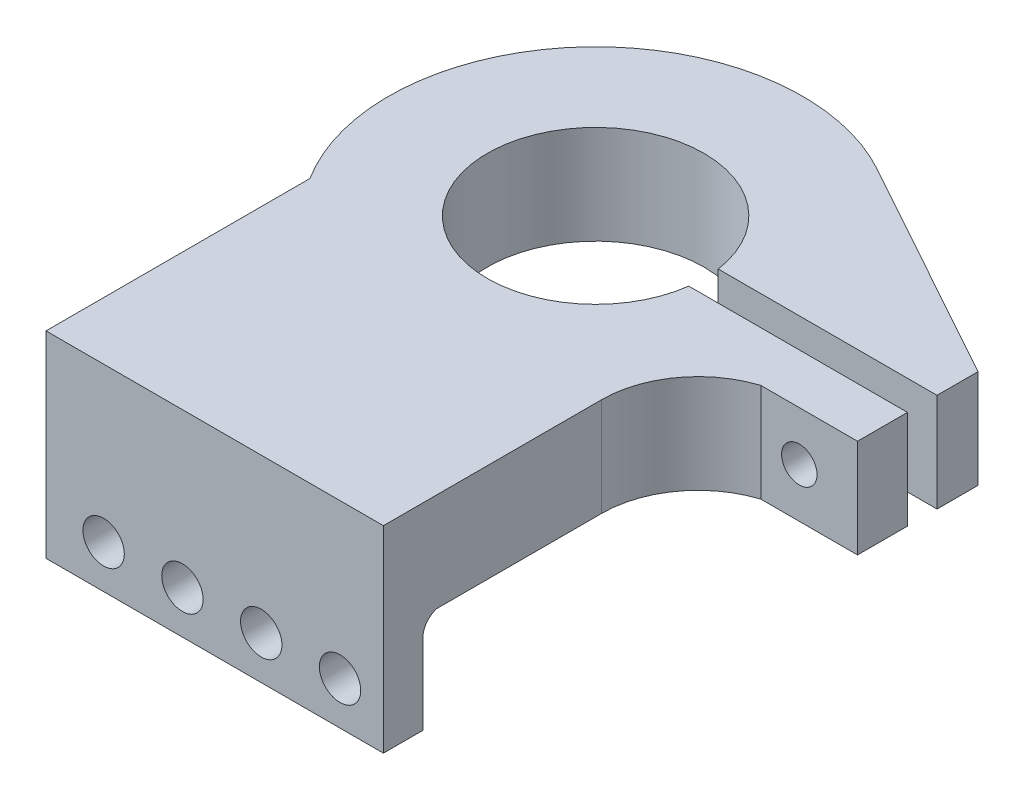
ISO-10303-21;
HEADER;
FILE_DESCRIPTION(('STEP AP214'),'2;1');
FILE_NAME('part.step','',(''),(''),'','','');
FILE_SCHEMA(('AUTOMOTIVE_DESIGN { 1 0 10303 214 1 1 1 1 }'));
ENDSEC;
DATA;
#1=APPLICATION_CONTEXT('core data for automotive mechanical design processes');
#2=APPLICATION_PROTOCOL_DEFINITION('international standard','automotive_design',2000,#1);
#3=PRODUCT_CONTEXT('',#1,'mechanical');
#4=PRODUCT('Part','Part','',(#3));
#5=PRODUCT_RELATED_PRODUCT_CATEGORY('part','',(#4));
#6=PRODUCT_DEFINITION_FORMATION('','',#4);
#7=PRODUCT_DEFINITION_CONTEXT('part definition',#1,'design');
#8=PRODUCT_DEFINITION('design','',#6,#7);
#9=PRODUCT_DEFINITION_SHAPE('','',#8);
#10=(LENGTH_UNIT() NAMED_UNIT(*) SI_UNIT(.MILLI.,.METRE.));
#11=(NAMED_UNIT(*) PLANE_ANGLE_UNIT() SI_UNIT($,.RADIAN.));
#12=(NAMED_UNIT(*) SI_UNIT($,.STERADIAN.) SOLID_ANGLE_UNIT());
#13=UNCERTAINTY_MEASURE_WITH_UNIT(LENGTH_MEASURE(1.E-05),#10,'distance_accuracy_value','');
#14=(GEOMETRIC_REPRESENTATION_CONTEXT(3) GLOBAL_UNCERTAINTY_ASSIGNED_CONTEXT((#13)) GLOBAL_UNIT_ASSIGNED_CONTEXT((#10,
#11,#12)) REPRESENTATION_CONTEXT('',''));
#15=CARTESIAN_POINT('',(0.,0.,0.));
#16=DIRECTION('',(0.,0.,1.));
#17=DIRECTION('',(1.,0.,0.));
#18=AXIS2_PLACEMENT_3D('',#15,#16,#17);
#19=CARTESIAN_POINT('',(0.,10.,-16.038925705294));
#20=DIRECTION('',(0.,-1.,0.));
#21=DIRECTION('',(0.,0.,-1.));
#22=AXIS2_PLACEMENT_3D('',#19,#20,#21);
#23=CYLINDRICAL_SURFACE('',#22,2.5);
#24=CARTESIAN_POINT('',(0.,0.,-16.038925705294));
#25=DIRECTION('',(0.,-1.,0.));
#26=DIRECTION('',(0.,0.,-1.));
#27=AXIS2_PLACEMENT_3D('',#24,#25,#26);
#28=CIRCLE('',#27,2.5);
#29=CARTESIAN_POINT('',(0.,0.,-18.538925705294));
#30=VERTEX_POINT('',#29);
#31=EDGE_CURVE('E622',#30,#30,#28,.T.);
#32=ORIENTED_EDGE('',*,*,#31,.T.);
#33=EDGE_LOOP('',(#32));
#34=FACE_BOUND('',#33,.T.);
#35=CARTESIAN_POINT('',(0.,9.5,-16.038925705294));
#36=DIRECTION('',(0.,1.,0.));
#37=DIRECTION('',(0.,0.,1.));
#38=AXIS2_PLACEMENT_3D('',#35,#36,#37);
#39=CIRCLE('',#38,2.5);
#40=CARTESIAN_POINT('',(0.,9.5,-13.538925705294));
#41=VERTEX_POINT('',#40);
#42=EDGE_CURVE('E12',#41,#41,#39,.F.);
#43=ORIENTED_EDGE('',*,*,#42,.F.);
#44=EDGE_LOOP('',(#43));
#45=FACE_BOUND('',#44,.T.);
#46=ADVANCED_FACE('F389',(#34,#45),#23,.F.);
#47=CARTESIAN_POINT('',(-11.341233129161,10.,-11.3412331291615));
#48=DIRECTION('',(0.,-1.,0.));
#49=DIRECTION('',(0.,0.,-1.));
#50=AXIS2_PLACEMENT_3D('',#47,#48,#49);
#51=CYLINDRICAL_SURFACE('',#50,2.50000000000011);
#52=CARTESIAN_POINT('',(-11.341233129161,0.,-11.3412331291615));
#53=DIRECTION('',(0.,-1.,0.));
#54=DIRECTION('',(0.,0.,-1.));
#55=AXIS2_PLACEMENT_3D('',#52,#53,#54);
#56=CIRCLE('',#55,2.50000000000011);
#57=CARTESIAN_POINT('',(-11.341233129161,0.,-13.8412331291616));
#58=VERTEX_POINT('',#57);
#59=EDGE_CURVE('E667',#58,#58,#56,.T.);
#60=ORIENTED_EDGE('',*,*,#59,.T.);
#61=EDGE_LOOP('',(#60));
#62=FACE_BOUND('',#61,.T.);
#63=CARTESIAN_POINT('',(-11.341233129161,9.5,-11.3412331291615));
#64=DIRECTION('',(0.,1.,0.));
#65=DIRECTION('',(0.,0.,1.));
#66=AXIS2_PLACEMENT_3D('',#63,#64,#65);
#67=CIRCLE('',#66,2.50000000000011);
#68=CARTESIAN_POINT('',(-11.341233129161,9.5,-8.84123312916134));
#69=VERTEX_POINT('',#68);
#70=EDGE_CURVE('E398',#69,#69,#67,.F.);
#71=ORIENTED_EDGE('',*,*,#70,.F.);
#72=EDGE_LOOP('',(#71));
#73=FACE_BOUND('',#72,.T.);
#74=ADVANCED_FACE('F790',(#62,#73),#51,.F.);
#75=CARTESIAN_POINT('',(-16.0389257052952,10.,-1.13668791207525E-12));
#76=DIRECTION('',(0.,-1.,0.));
#77=DIRECTION('',(0.,0.,-1.));
#78=AXIS2_PLACEMENT_3D('',#75,#76,#77);
#79=CYLINDRICAL_SURFACE('',#78,2.50000000000081);
#80=CARTESIAN_POINT('',(-16.0389257052952,0.,-1.13668791207525E-12));
#81=DIRECTION('',(0.,-1.,0.));
#82=DIRECTION('',(0.,0.,-1.));
#83=AXIS2_PLACEMENT_3D('',#80,#81,#82);
#84=CIRCLE('',#83,2.50000000000081);
#85=CARTESIAN_POINT('',(-16.0389257052952,0.,-2.50000000000195));
#86=VERTEX_POINT('',#85);
#87=EDGE_CURVE('E663',#86,#86,#84,.T.);
#88=ORIENTED_EDGE('',*,*,#87,.T.);
#89=EDGE_LOOP('',(#88));
#90=FACE_BOUND('',#89,.T.);
#91=CARTESIAN_POINT('',(-16.0389257052952,9.5,-1.13668791207525E-12));
#92=DIRECTION('',(0.,1.,0.));
#93=DIRECTION('',(0.,0.,1.));
#94=AXIS2_PLACEMENT_3D('',#91,#92,#93);
#95=CIRCLE('',#94,2.50000000000081);
#96=CARTESIAN_POINT('',(-16.0389257052952,9.5,2.49999999999967));
#97=VERTEX_POINT('',#96);
#98=EDGE_CURVE('E557',#97,#97,#95,.F.);
#99=ORIENTED_EDGE('',*,*,#98,.F.);
#100=EDGE_LOOP('',(#99));
#101=FACE_BOUND('',#100,.T.);
#102=ADVANCED_FACE('F796',(#90,#101),#79,.F.);
#103=CARTESIAN_POINT('',(-11.3412331291626,10.,11.3412331291598));
#104=DIRECTION('',(0.,-1.,0.));
#105=DIRECTION('',(0.,0.,-1.));
#106=AXIS2_PLACEMENT_3D('',#103,#104,#105);
#107=CYLINDRICAL_SURFACE('',#106,2.5000000000017);
#108=CARTESIAN_POINT('',(-11.3412331291626,0.,11.3412331291598));
#109=DIRECTION('',(0.,-1.,0.));
#110=DIRECTION('',(0.,0.,-1.));
#111=AXIS2_PLACEMENT_3D('',#108,#109,#110);
#112=CIRCLE('',#111,2.5000000000017);
#113=CARTESIAN_POINT('',(-11.3412331291626,0.,8.84123312915814));
#114=VERTEX_POINT('',#113);
#115=EDGE_CURVE('E660',#114,#114,#112,.T.);
#116=ORIENTED_EDGE('',*,*,#115,.T.);
#117=EDGE_LOOP('',(#116));
#118=FACE_BOUND('',#117,.T.);
#119=CARTESIAN_POINT('',(-11.3412331291626,9.5,11.3412331291598));
#120=DIRECTION('',(0.,1.,0.));
#121=DIRECTION('',(0.,0.,1.));
#122=AXIS2_PLACEMENT_3D('',#119,#120,#121);
#123=CIRCLE('',#122,2.5000000000017);
#124=CARTESIAN_POINT('',(-11.3412331291626,9.5,13.8412331291615));
#125=VERTEX_POINT('',#124);
#126=EDGE_CURVE('E554',#125,#125,#123,.F.);
#127=ORIENTED_EDGE('',*,*,#126,.F.);
#128=EDGE_LOOP('',(#127));
#129=FACE_BOUND('',#128,.T.);
#130=ADVANCED_FACE('F810',(#118,#129),#107,.F.);
#131=CARTESIAN_POINT('',(-2.2733758241505E-12,10.,16.038925705294));
#132=DIRECTION('',(0.,-1.,0.));
#133=DIRECTION('',(0.,0.,-1.));
#134=AXIS2_PLACEMENT_3D('',#131,#132,#133);
#135=CYLINDRICAL_SURFACE('',#134,2.50000000000228);
#136=CARTESIAN_POINT('',(-2.2733758241505E-12,0.,16.038925705294));
#137=DIRECTION('',(0.,-1.,0.));
#138=DIRECTION('',(0.,0.,-1.));
#139=AXIS2_PLACEMENT_3D('',#136,#137,#138);
#140=CIRCLE('',#139,2.50000000000228);
#141=CARTESIAN_POINT('',(-2.2733758241505E-12,0.,13.5389257052918));
#142=VERTEX_POINT('',#141);
#143=EDGE_CURVE('E664',#142,#142,#140,.T.);
#144=ORIENTED_EDGE('',*,*,#143,.T.);
#145=EDGE_LOOP('',(#144));
#146=FACE_BOUND('',#145,.T.);
#147=CARTESIAN_POINT('',(-2.2733758241505E-12,9.5,16.038925705294));
#148=DIRECTION('',(0.,1.,0.));
#149=DIRECTION('',(0.,0.,1.));
#150=AXIS2_PLACEMENT_3D('',#147,#148,#149);
#151=CIRCLE('',#150,2.50000000000228);
#152=CARTESIAN_POINT('',(-2.2733758241505E-12,9.5,18.5389257052963));
#153=VERTEX_POINT('',#152);
#154=EDGE_CURVE('E551',#153,#153,#151,.F.);
#155=ORIENTED_EDGE('',*,*,#154,.F.);
#156=EDGE_LOOP('',(#155));
#157=FACE_BOUND('',#156,.T.);
#158=ADVANCED_FACE('F806',(#146,#157),#135,.F.);
#159=CARTESIAN_POINT('',(11.3412331291587,10.,11.3412331291615));
#160=DIRECTION('',(0.,-1.,0.));
#161=DIRECTION('',(0.,0.,-1.));
#162=AXIS2_PLACEMENT_3D('',#159,#160,#161);
#163=CYLINDRICAL_SURFACE('',#162,2.50000000000222);
#164=CARTESIAN_POINT('',(11.3412331291587,0.,11.3412331291615));
#165=DIRECTION('',(0.,-1.,0.));
#166=DIRECTION('',(0.,0.,-1.));
#167=AXIS2_PLACEMENT_3D('',#164,#165,#166);
#168=CIRCLE('',#167,2.50000000000222);
#169=CARTESIAN_POINT('',(11.3412331291587,0.,8.84123312915923));
#170=VERTEX_POINT('',#169);
#171=EDGE_CURVE('E659',#170,#170,#168,.T.);
#172=ORIENTED_EDGE('',*,*,#171,.T.);
#173=EDGE_LOOP('',(#172));
#174=FACE_BOUND('',#173,.T.);
#175=CARTESIAN_POINT('',(11.3412331291587,9.5,11.3412331291615));
#176=DIRECTION('',(0.,1.,0.));
#177=DIRECTION('',(0.,0.,1.));
#178=AXIS2_PLACEMENT_3D('',#175,#176,#177);
#179=CIRCLE('',#178,2.50000000000222);
#180=CARTESIAN_POINT('',(11.3412331291587,9.5,13.8412331291637));
#181=VERTEX_POINT('',#180);
#182=EDGE_CURVE('E548',#181,#181,#179,.F.);
#183=ORIENTED_EDGE('',*,*,#182,.F.);
#184=EDGE_LOOP('',(#183));
#185=FACE_BOUND('',#184,.T.);
#186=ADVANCED_FACE('F802',(#174,#185),#163,.F.);
#187=CARTESIAN_POINT('',(11.3412331291603,10.,-11.3412331291598));
#188=DIRECTION('',(0.,-1.,0.));
#189=DIRECTION('',(0.,0.,-1.));
#190=AXIS2_PLACEMENT_3D('',#187,#188,#189);
#191=CYLINDRICAL_SURFACE('',#190,2.50000000000074);
#192=CARTESIAN_POINT('',(11.3412331291603,0.,-11.3412331291598));
#193=DIRECTION('',(0.,-1.,0.));
#194=DIRECTION('',(0.,0.,-1.));
#195=AXIS2_PLACEMENT_3D('',#192,#193,#194);
#196=CIRCLE('',#195,2.50000000000074);
#197=CARTESIAN_POINT('',(11.3412331291603,0.,-13.8412331291606));
#198=VERTEX_POINT('',#197);
#199=EDGE_CURVE('E629',#198,#198,#196,.T.);
#200=ORIENTED_EDGE('',*,*,#199,.T.);
#201=EDGE_LOOP('',(#200));
#202=FACE_BOUND('',#201,.T.);
#203=CARTESIAN_POINT('',(11.3412331291603,9.5,-11.3412331291598));
#204=DIRECTION('',(0.,1.,0.));
#205=DIRECTION('',(0.,0.,1.));
#206=AXIS2_PLACEMENT_3D('',#203,#204,#205);
#207=CIRCLE('',#206,2.50000000000074);
#208=CARTESIAN_POINT('',(11.3412331291603,9.5,-8.8412331291591));
#209=VERTEX_POINT('',#208);
#210=EDGE_CURVE('E515',#209,#209,#207,.F.);
#211=ORIENTED_EDGE('',*,*,#210,.F.);
#212=EDGE_LOOP('',(#211));
#213=FACE_BOUND('',#212,.T.);
#214=ADVANCED_FACE('F805',(#202,#213),#191,.F.);
#215=CARTESIAN_POINT('',(27.1910525994067,4.99999999999999,-20.4829807744499));
#216=DIRECTION('',(0.,0.,1.));
#217=DIRECTION('',(1.,0.,0.));
#218=AXIS2_PLACEMENT_3D('',#215,#216,#217);
#219=CYLINDRICAL_SURFACE('',#218,1.8);
#220=CARTESIAN_POINT('',(27.1910525994067,4.99999999999999,-1.55307540507215));
#221=DIRECTION('',(0.,0.,-1.));
#222=DIRECTION('',(-1.,0.,0.));
#223=AXIS2_PLACEMENT_3D('',#220,#221,#222);
#224=CIRCLE('',#223,1.8);
#225=CARTESIAN_POINT('',(25.3910525994067,4.99999999999999,-1.55307540507215));
#226=VERTEX_POINT('',#225);
#227=EDGE_CURVE('E577',#226,#226,#224,.F.);
#228=ORIENTED_EDGE('',*,*,#227,.T.);
#229=EDGE_LOOP('',(#228));
#230=FACE_BOUND('',#229,.T.);
#231=CARTESIAN_POINT('',(27.1910525994067,4.99999999999999,-2.55307540507215));
#232=DIRECTION('',(0.,0.,-1.));
#233=DIRECTION('',(-1.,0.,0.));
#234=AXIS2_PLACEMENT_3D('',#231,#232,#233);
#235=CIRCLE('',#234,1.8);
#236=CARTESIAN_POINT('',(25.3910525994067,4.99999999999999,-2.55307540507215));
#237=VERTEX_POINT('',#236);
#238=EDGE_CURVE('E525',#237,#237,#235,.T.);
#239=ORIENTED_EDGE('',*,*,#238,.T.);
#240=EDGE_LOOP('',(#239));
#241=FACE_BOUND('',#240,.T.);
#242=ADVANCED_FACE('F821',(#230,#241),#219,.F.);
#243=CARTESIAN_POINT('',(8.75424242431617,0.,-1.55307540507215));
#244=DIRECTION('',(0.,0.,-1.));
#245=DIRECTION('',(-1.,0.,0.));
#246=AXIS2_PLACEMENT_3D('',#243,#244,#245);
#247=PLANE('',#246);
#248=DIRECTION('',(0.,-1.,0.));
#249=VECTOR('',#248,1.);
#250=CARTESIAN_POINT('',(10.8898097681346,10.,-1.55307540507215));
#251=LINE('',#250,#249);
#252=CARTESIAN_POINT('',(10.8898097681346,10.,-1.55307540507215));
#253=VERTEX_POINT('',#252);
#254=CARTESIAN_POINT('',(10.8898097681346,0.,-1.55307540507215));
#255=VERTEX_POINT('',#254);
#256=EDGE_CURVE('E630',#253,#255,#251,.T.);
#257=ORIENTED_EDGE('',*,*,#256,.T.);
#258=DIRECTION('',(-1.,0.,0.));
#259=VECTOR('',#258,1.);
#260=CARTESIAN_POINT('',(8.75424242431617,0.,-1.55307540507215));
#261=LINE('',#260,#259);
#262=CARTESIAN_POINT('',(33.1001256676294,0.,-1.55307540507215));
#263=VERTEX_POINT('',#262);
#264=EDGE_CURVE('E636',#263,#255,#261,.T.);
#265=ORIENTED_EDGE('',*,*,#264,.F.);
#266=DIRECTION('',(0.,1.,0.));
#267=VECTOR('',#266,1.);
#268=CARTESIAN_POINT('',(33.1001256676294,0.,-1.55307540507215));
#269=LINE('',#268,#267);
#270=CARTESIAN_POINT('',(33.1001256676294,10.,-1.55307540507215));
#271=VERTEX_POINT('',#270);
#272=EDGE_CURVE('E531',#263,#271,#269,.T.);
#273=ORIENTED_EDGE('',*,*,#272,.T.);
#274=DIRECTION('',(-1.,0.,0.));
#275=VECTOR('',#274,1.);
#276=CARTESIAN_POINT('',(8.75424242431617,10.,-1.55307540507215));
#277=LINE('',#276,#275);
#278=EDGE_CURVE('E537',#271,#253,#277,.T.);
#279=ORIENTED_EDGE('',*,*,#278,.T.);
#280=EDGE_LOOP('',(#257,#265,#273,#279));
#281=FACE_BOUND('',#280,.T.);
#282=ORIENTED_EDGE('',*,*,#227,.F.);
#283=EDGE_LOOP('',(#282));
#284=FACE_BOUND('',#283,.T.);
#285=ADVANCED_FACE('F719',(#281,#284),#247,.F.);
#286=CARTESIAN_POINT('',(8.75424242431617,0.,1.44692459492785));
#287=DIRECTION('',(0.,0.,1.));
#288=DIRECTION('',(1.,0.,0.));
#289=AXIS2_PLACEMENT_3D('',#286,#287,#288);
#290=PLANE('',#289);
#291=DIRECTION('',(1.,0.,0.));
#292=VECTOR('',#291,1.);
#293=CARTESIAN_POINT('',(8.75424242431617,10.,1.44692459492785));
#294=LINE('',#293,#292);
#295=CARTESIAN_POINT('',(10.9044215443366,10.,1.44692459492785));
#296=VERTEX_POINT('',#295);
#297=CARTESIAN_POINT('',(33.1001256676294,10.,1.44692459492785));
#298=VERTEX_POINT('',#297);
#299=EDGE_CURVE('E413',#296,#298,#294,.T.);
#300=ORIENTED_EDGE('',*,*,#299,.T.);
#301=DIRECTION('',(0.,-1.,0.));
#302=VECTOR('',#301,1.);
#303=CARTESIAN_POINT('',(33.1001256676294,0.,1.44692459492785));
#304=LINE('',#303,#302);
#305=CARTESIAN_POINT('',(33.1001256676294,0.,1.44692459492785));
#306=VERTEX_POINT('',#305);
#307=EDGE_CURVE('E542',#298,#306,#304,.T.);
#308=ORIENTED_EDGE('',*,*,#307,.T.);
#309=DIRECTION('',(1.,0.,0.));
#310=VECTOR('',#309,1.);
#311=CARTESIAN_POINT('',(8.75424242431617,0.,1.44692459492785));
#312=LINE('',#311,#310);
#313=CARTESIAN_POINT('',(10.9044215443366,0.,1.44692459492785));
#314=VERTEX_POINT('',#313);
#315=EDGE_CURVE('E635',#314,#306,#312,.T.);
#316=ORIENTED_EDGE('',*,*,#315,.F.);
#317=DIRECTION('',(0.,-1.,0.));
#318=VECTOR('',#317,1.);
#319=CARTESIAN_POINT('',(10.9044215443366,10.,1.44692459492785));
#320=LINE('',#319,#318);
#321=EDGE_CURVE('E627',#314,#296,#320,.F.);
#322=ORIENTED_EDGE('',*,*,#321,.T.);
#323=EDGE_LOOP('',(#300,#308,#316,#322));
#324=FACE_BOUND('',#323,.T.);
#325=CARTESIAN_POINT('',(27.1910525994067,4.99999999999999,1.44692459492785));
#326=DIRECTION('',(0.,0.,1.));
#327=DIRECTION('',(1.,0.,0.));
#328=AXIS2_PLACEMENT_3D('',#325,#326,#327);
#329=CIRCLE('',#328,1.8);
#330=CARTESIAN_POINT('',(28.9910525994067,4.99999999999999,1.44692459492785));
#331=VERTEX_POINT('',#330);
#332=EDGE_CURVE('E573',#331,#331,#329,.F.);
#333=ORIENTED_EDGE('',*,*,#332,.F.);
#334=EDGE_LOOP('',(#333));
#335=FACE_BOUND('',#334,.T.);
#336=ADVANCED_FACE('F725',(#324,#335),#290,.F.);
#337=CARTESIAN_POINT('',(33.1001256676294,0.,0.));
#338=DIRECTION('',(1.,0.,0.));
#339=DIRECTION('',(0.,0.,-1.));
#340=AXIS2_PLACEMENT_3D('',#337,#338,#339);
#341=PLANE('',#340);
#342=ORIENTED_EDGE('',*,*,#307,.F.);
#343=DIRECTION('',(0.,0.,1.));
#344=VECTOR('',#343,1.);
#345=CARTESIAN_POINT('',(33.1001256676294,10.,6.51701922555015));
#346=LINE('',#345,#344);
#347=CARTESIAN_POINT('',(33.1001256676294,10.,6.51701922555015));
#348=VERTEX_POINT('',#347);
#349=EDGE_CURVE('E596',#298,#348,#346,.T.);
#350=ORIENTED_EDGE('',*,*,#349,.T.);
#351=DIRECTION('',(0.,-1.,0.));
#352=VECTOR('',#351,1.);
#353=CARTESIAN_POINT('',(33.1001256676294,10.,6.51701922555015));
#354=LINE('',#353,#352);
#355=CARTESIAN_POINT('',(33.1001256676294,0.,6.51701922555015));
#356=VERTEX_POINT('',#355);
#357=EDGE_CURVE('E589',#348,#356,#354,.T.);
#358=ORIENTED_EDGE('',*,*,#357,.T.);
#359=DIRECTION('',(0.,0.,-1.));
#360=VECTOR('',#359,1.);
#361=CARTESIAN_POINT('',(33.1001256676294,0.,6.51701922555015));
#362=LINE('',#361,#360);
#363=EDGE_CURVE('E593',#356,#306,#362,.T.);
#364=ORIENTED_EDGE('',*,*,#363,.T.);
#365=EDGE_LOOP('',(#342,#350,#358,#364));
#366=FACE_BOUND('',#365,.T.);
#367=ADVANCED_FACE('F734',(#366),#341,.T.);
#368=CARTESIAN_POINT('',(0.,0.,0.));
#369=DIRECTION('',(0.,1.,0.));
#370=DIRECTION('',(0.,0.,1.));
#371=AXIS2_PLACEMENT_3D('',#368,#369,#370);
#372=PLANE('',#371);
#373=DIRECTION('',(0.87494874334881,0.,0.484215547573948));
#374=VECTOR('',#373,1.);
#375=CARTESIAN_POINT('',(10.1811467052754,0.,-18.396727573623));
#376=LINE('',#375,#374);
#377=CARTESIAN_POINT('',(10.1811467052754,0.,-18.396727573623));
#378=VERTEX_POINT('',#377);
#379=CARTESIAN_POINT('',(33.1001256676294,0.,-5.71286919625543));
#380=VERTEX_POINT('',#379);
#381=EDGE_CURVE('E612',#378,#380,#376,.T.);
#382=ORIENTED_EDGE('',*,*,#381,.T.);
#383=EDGE_CURVE('E592',#263,#380,#362,.T.);
#384=ORIENTED_EDGE('',*,*,#383,.F.);
#385=ORIENTED_EDGE('',*,*,#264,.T.);
#386=CARTESIAN_POINT('',(0.,0.,0.));
#387=DIRECTION('',(0.,1.,0.));
#388=DIRECTION('',(0.,0.,1.));
#389=AXIS2_PLACEMENT_3D('',#386,#387,#388);
#390=CIRCLE('',#389,11.);
#391=EDGE_CURVE('E633',#255,#314,#390,.T.);
#392=ORIENTED_EDGE('',*,*,#391,.T.);
#393=ORIENTED_EDGE('',*,*,#315,.T.);
#394=ORIENTED_EDGE('',*,*,#363,.F.);
#395=DIRECTION('',(-1.,0.,0.));
#396=VECTOR('',#395,1.);
#397=CARTESIAN_POINT('',(0.,0.,6.51701922555015));
#398=LINE('',#397,#396);
#399=CARTESIAN_POINT('',(23.2819795311839,0.,6.51701922555015));
#400=VERTEX_POINT('',#399);
#401=EDGE_CURVE('E606',#356,#400,#398,.T.);
#402=ORIENTED_EDGE('',*,*,#401,.T.);
#403=CARTESIAN_POINT('',(26.2436470711757,0.,15.8400703035682));
#404=DIRECTION('',(0.,1.,0.));
#405=DIRECTION('',(0.,0.,1.));
#406=AXIS2_PLACEMENT_3D('',#403,#404,#405);
#407=CIRCLE('',#406,9.78216520105717);
#408=CARTESIAN_POINT('',(16.4614818701186,0.,15.8400703035682));
#409=VERTEX_POINT('',#408);
#410=EDGE_CURVE('E642',#400,#409,#407,.T.);
#411=ORIENTED_EDGE('',*,*,#410,.T.);
#412=DIRECTION('',(0.,0.,1.));
#413=VECTOR('',#412,1.);
#414=CARTESIAN_POINT('',(16.4614818701186,0.,0.));
#415=LINE('',#414,#413);
#416=CARTESIAN_POINT('',(16.4614818701186,0.,32.5814003102691));
#417=VERTEX_POINT('',#416);
#418=EDGE_CURVE('E656',#409,#417,#415,.T.);
#419=ORIENTED_EDGE('',*,*,#418,.T.);
#420=DIRECTION('',(1.,0.,0.));
#421=VECTOR('',#420,1.);
#422=CARTESIAN_POINT('',(-18.7287980754457,0.,32.5814003102691));
#423=LINE('',#422,#421);
#424=CARTESIAN_POINT('',(-17.7868538881947,0.,32.5814003102691));
#425=VERTEX_POINT('',#424);
#426=EDGE_CURVE('E626',#425,#417,#423,.T.);
#427=ORIENTED_EDGE('',*,*,#426,.F.);
#428=DIRECTION('',(0.,0.,1.));
#429=VECTOR('',#428,1.);
#430=CARTESIAN_POINT('',(-17.7868538881947,0.,32.5814003102691));
#431=LINE('',#430,#429);
#432=CARTESIAN_POINT('',(-17.7868538881947,0.,11.2126340532658));
#433=VERTEX_POINT('',#432);
#434=EDGE_CURVE('E529',#433,#425,#431,.T.);
#435=ORIENTED_EDGE('',*,*,#434,.F.);
#436=CARTESIAN_POINT('',(0.,0.,0.));
#437=DIRECTION('',(0.,-1.,0.));
#438=DIRECTION('',(0.,0.,-1.));
#439=AXIS2_PLACEMENT_3D('',#436,#437,#438);
#440=CIRCLE('',#439,21.0260631990975);
#441=EDGE_CURVE('E618',#433,#378,#440,.T.);
#442=ORIENTED_EDGE('',*,*,#441,.T.);
#443=EDGE_LOOP('',(#382,#384,#385,#392,#393,#394,#402,#411,#419,#427,#435,#442));
#444=FACE_BOUND('',#443,.T.);
#445=ORIENTED_EDGE('',*,*,#199,.F.);
#446=EDGE_LOOP('',(#445));
#447=FACE_BOUND('',#446,.T.);
#448=ORIENTED_EDGE('',*,*,#171,.F.);
#449=EDGE_LOOP('',(#448));
#450=FACE_BOUND('',#449,.T.);
#451=ORIENTED_EDGE('',*,*,#143,.F.);
#452=EDGE_LOOP('',(#451));
#453=FACE_BOUND('',#452,.T.);
#454=ORIENTED_EDGE('',*,*,#115,.F.);
#455=EDGE_LOOP('',(#454));
#456=FACE_BOUND('',#455,.T.);
#457=ORIENTED_EDGE('',*,*,#87,.F.);
#458=EDGE_LOOP('',(#457));
#459=FACE_BOUND('',#458,.T.);
#460=ORIENTED_EDGE('',*,*,#59,.F.);
#461=EDGE_LOOP('',(#460));
#462=FACE_BOUND('',#461,.T.);
#463=ORIENTED_EDGE('',*,*,#31,.F.);
#464=EDGE_LOOP('',(#463));
#465=FACE_BOUND('',#464,.T.);
#466=ADVANCED_FACE('F391',(#444,#447,#450,#453,#456,#459,#462,#465),#372,.F.);
#467=CARTESIAN_POINT('',(0.,10.,0.));
#468=DIRECTION('',(0.,1.,0.));
#469=DIRECTION('',(0.,0.,1.));
#470=AXIS2_PLACEMENT_3D('',#467,#468,#469);
#471=PLANE('',#470);
#472=CARTESIAN_POINT('',(33.1001256676294,10.,-5.71286919625543));
#473=VERTEX_POINT('',#472);
#474=EDGE_CURVE('E598',#473,#271,#346,.T.);
#475=ORIENTED_EDGE('',*,*,#474,.F.);
#476=DIRECTION('',(0.87494874334881,0.,0.484215547573948));
#477=VECTOR('',#476,1.);
#478=CARTESIAN_POINT('',(10.1811467052754,10.,-18.396727573623));
#479=LINE('',#478,#477);
#480=CARTESIAN_POINT('',(10.1811467052754,10.,-18.396727573623));
#481=VERTEX_POINT('',#480);
#482=EDGE_CURVE('E609',#481,#473,#479,.T.);
#483=ORIENTED_EDGE('',*,*,#482,.F.);
#484=CARTESIAN_POINT('',(0.,10.,0.));
#485=DIRECTION('',(0.,1.,0.));
#486=DIRECTION('',(0.,0.,-1.));
#487=AXIS2_PLACEMENT_3D('',#484,#485,#486);
#488=CIRCLE('',#487,21.0260631990975);
#489=CARTESIAN_POINT('',(-17.7868538881947,10.,11.2126340532658));
#490=VERTEX_POINT('',#489);
#491=EDGE_CURVE('E647',#481,#490,#488,.T.);
#492=ORIENTED_EDGE('',*,*,#491,.T.);
#493=DIRECTION('',(0.,0.,-1.));
#494=VECTOR('',#493,1.);
#495=CARTESIAN_POINT('',(-17.7868538881947,10.,19.5310071470047));
#496=LINE('',#495,#494);
#497=CARTESIAN_POINT('',(-17.7868538881947,10.,38.0028131008033));
#498=VERTEX_POINT('',#497);
#499=EDGE_CURVE('E693',#498,#490,#496,.T.);
#500=ORIENTED_EDGE('',*,*,#499,.F.);
#501=DIRECTION('',(1.,0.,0.));
#502=VECTOR('',#501,1.);
#503=CARTESIAN_POINT('',(36.7712019245543,10.,38.0028131008033));
#504=LINE('',#503,#502);
#505=CARTESIAN_POINT('',(16.4614818701186,10.,38.0028131008033));
#506=VERTEX_POINT('',#505);
#507=EDGE_CURVE('E643',#498,#506,#504,.T.);
#508=ORIENTED_EDGE('',*,*,#507,.T.);
#509=DIRECTION('',(0.,0.,-1.));
#510=VECTOR('',#509,1.);
#511=CARTESIAN_POINT('',(16.4614818701186,10.,0.));
#512=LINE('',#511,#510);
#513=CARTESIAN_POINT('',(16.4614818701186,10.,15.8400703035682));
#514=VERTEX_POINT('',#513);
#515=EDGE_CURVE('E646',#506,#514,#512,.T.);
#516=ORIENTED_EDGE('',*,*,#515,.T.);
#517=CARTESIAN_POINT('',(26.2436470711757,10.,15.8400703035682));
#518=DIRECTION('',(0.,-1.,0.));
#519=DIRECTION('',(0.,0.,-1.));
#520=AXIS2_PLACEMENT_3D('',#517,#518,#519);
#521=CIRCLE('',#520,9.78216520105717);
#522=CARTESIAN_POINT('',(23.2819795311839,10.,6.51701922555015));
#523=VERTEX_POINT('',#522);
#524=EDGE_CURVE('E687',#514,#523,#521,.T.);
#525=ORIENTED_EDGE('',*,*,#524,.T.);
#526=DIRECTION('',(-1.,0.,0.));
#527=VECTOR('',#526,1.);
#528=CARTESIAN_POINT('',(0.,10.,6.51701922555015));
#529=LINE('',#528,#527);
#530=EDGE_CURVE('E605',#348,#523,#529,.T.);
#531=ORIENTED_EDGE('',*,*,#530,.F.);
#532=ORIENTED_EDGE('',*,*,#349,.F.);
#533=ORIENTED_EDGE('',*,*,#299,.F.);
#534=CARTESIAN_POINT('',(0.,10.,0.));
#535=DIRECTION('',(0.,1.,0.));
#536=DIRECTION('',(0.,0.,1.));
#537=AXIS2_PLACEMENT_3D('',#534,#535,#536);
#538=CIRCLE('',#537,11.);
#539=EDGE_CURVE('E637',#253,#296,#538,.T.);
#540=ORIENTED_EDGE('',*,*,#539,.F.);
#541=ORIENTED_EDGE('',*,*,#278,.F.);
#542=EDGE_LOOP('',(#475,#483,#492,#500,#508,#516,#525,#531,#532,#533,#540,#541));
#543=FACE_BOUND('',#542,.T.);
#544=ADVANCED_FACE('F730',(#543),#471,.T.);
#545=CARTESIAN_POINT('',(17.2131461118053,-1.88895652195153,32.0369622585518));
#546=DIRECTION('',(-1.,0.,0.));
#547=DIRECTION('',(0.,0.,1.));
#548=AXIS2_PLACEMENT_3D('',#545,#546,#547);
#549=CYLINDRICAL_SURFACE('',#548,1.96585084225152);
#550=ORIENTED_EDGE('',*,*,#426,.T.);
#551=CARTESIAN_POINT('',(16.4614818701186,-1.88895652195153,32.0369622585518));
#552=DIRECTION('',(1.,0.,0.));
#553=DIRECTION('',(0.,0.,-1.));
#554=AXIS2_PLACEMENT_3D('',#551,#552,#553);
#555=CIRCLE('',#554,1.96585084225152);
#556=CARTESIAN_POINT('',(16.4614818701186,-1.88895652195153,34.0028131008033));
#557=VERTEX_POINT('',#556);
#558=EDGE_CURVE('E623',#417,#557,#555,.T.);
#559=ORIENTED_EDGE('',*,*,#558,.T.);
#560=DIRECTION('',(-1.,0.,0.));
#561=VECTOR('',#560,1.);
#562=CARTESIAN_POINT('',(17.2131461118053,-1.88895652195153,34.0028131008033));
#563=LINE('',#562,#561);
#564=CARTESIAN_POINT('',(-17.7868538881947,-1.88895652195153,34.0028131008033));
#565=VERTEX_POINT('',#564);
#566=EDGE_CURVE('E625',#557,#565,#563,.T.);
#567=ORIENTED_EDGE('',*,*,#566,.T.);
#568=CARTESIAN_POINT('',(-17.7868538881947,-1.88895652195153,32.0369622585518));
#569=DIRECTION('',(1.,0.,0.));
#570=DIRECTION('',(0.,0.,1.));
#571=AXIS2_PLACEMENT_3D('',#568,#569,#570);
#572=CIRCLE('',#571,1.96585084225152);
#573=EDGE_CURVE('E683',#425,#565,#572,.T.);
#574=ORIENTED_EDGE('',*,*,#573,.F.);
#575=EDGE_LOOP('',(#550,#559,#567,#574));
#576=FACE_BOUND('',#575,.T.);
#577=ADVANCED_FACE('F765',(#576),#549,.F.);
#578=CARTESIAN_POINT('',(-18.7287980754457,0.,34.0028131008033));
#579=DIRECTION('',(0.,0.,-1.));
#580=DIRECTION('',(-1.,0.,0.));
#581=AXIS2_PLACEMENT_3D('',#578,#579,#580);
#582=PLANE('',#581);
#583=CARTESIAN_POINT('',(-11.9394176812472,-5.64597972606719,34.0028131008033));
#584=DIRECTION('',(0.,0.,-1.));
#585=DIRECTION('',(-1.,0.,0.));
#586=AXIS2_PLACEMENT_3D('',#583,#584,#585);
#587=CIRCLE('',#586,2.1);
#588=CARTESIAN_POINT('',(-14.0394176812472,-5.64597972606719,34.0028131008033));
#589=VERTEX_POINT('',#588);
#590=EDGE_CURVE('E566',#589,#589,#587,.T.);
#591=ORIENTED_EDGE('',*,*,#590,.F.);
#592=EDGE_LOOP('',(#591));
#593=FACE_BOUND('',#592,.T.);
#594=CARTESIAN_POINT('',(-3.9394176812472,-5.64597972606725,34.0028131008033));
#595=DIRECTION('',(0.,0.,-1.));
#596=DIRECTION('',(-1.,0.,0.));
#597=AXIS2_PLACEMENT_3D('',#594,#595,#596);
#598=CIRCLE('',#597,2.1);
#599=CARTESIAN_POINT('',(-6.0394176812472,-5.64597972606725,34.0028131008033));
#600=VERTEX_POINT('',#599);
#601=EDGE_CURVE('E1234',#600,#600,#598,.T.);
#602=ORIENTED_EDGE('',*,*,#601,.F.);
#603=EDGE_LOOP('',(#602));
#604=FACE_BOUND('',#603,.T.);
#605=CARTESIAN_POINT('',(4.0605823187528,-5.64597972606731,34.0028131008033));
#606=DIRECTION('',(0.,0.,-1.));
#607=DIRECTION('',(-1.,0.,0.));
#608=AXIS2_PLACEMENT_3D('',#605,#606,#607);
#609=CIRCLE('',#608,2.1);
#610=CARTESIAN_POINT('',(1.9605823187528,-5.64597972606731,34.0028131008033));
#611=VERTEX_POINT('',#610);
#612=EDGE_CURVE('E1232',#611,#611,#609,.T.);
#613=ORIENTED_EDGE('',*,*,#612,.F.);
#614=EDGE_LOOP('',(#613));
#615=FACE_BOUND('',#614,.T.);
#616=CARTESIAN_POINT('',(12.0605823187528,-5.64597972606736,34.0028131008033));
#617=DIRECTION('',(0.,0.,-1.));
#618=DIRECTION('',(-1.,0.,0.));
#619=AXIS2_PLACEMENT_3D('',#616,#617,#618);
#620=CIRCLE('',#619,2.1);
#621=CARTESIAN_POINT('',(9.9605823187528,-5.64597972606736,34.0028131008033));
#622=VERTEX_POINT('',#621);
#623=EDGE_CURVE('E584',#622,#622,#620,.T.);
#624=ORIENTED_EDGE('',*,*,#623,.F.);
#625=EDGE_LOOP('',(#624));
#626=FACE_BOUND('',#625,.T.);
#627=ORIENTED_EDGE('',*,*,#566,.F.);
#628=DIRECTION('',(0.,1.,0.));
#629=VECTOR('',#628,1.);
#630=CARTESIAN_POINT('',(16.4614818701186,0.,34.0028131008033));
#631=LINE('',#630,#629);
#632=CARTESIAN_POINT('',(16.4614818701186,-10.,34.0028131008033));
#633=VERTEX_POINT('',#632);
#634=EDGE_CURVE('E680',#633,#557,#631,.T.);
#635=ORIENTED_EDGE('',*,*,#634,.F.);
#636=DIRECTION('',(1.,0.,0.));
#637=VECTOR('',#636,1.);
#638=CARTESIAN_POINT('',(-18.7287980754457,-10.,34.0028131008033));
#639=LINE('',#638,#637);
#640=CARTESIAN_POINT('',(-17.7868538881947,-10.,34.0028131008033));
#641=VERTEX_POINT('',#640);
#642=EDGE_CURVE('E639',#641,#633,#639,.T.);
#643=ORIENTED_EDGE('',*,*,#642,.F.);
#644=DIRECTION('',(0.,-1.,0.));
#645=VECTOR('',#644,1.);
#646=CARTESIAN_POINT('',(-17.7868538881947,-10.,34.0028131008033));
#647=LINE('',#646,#645);
#648=EDGE_CURVE('E702',#565,#641,#647,.T.);
#649=ORIENTED_EDGE('',*,*,#648,.F.);
#650=EDGE_LOOP('',(#627,#635,#643,#649));
#651=FACE_BOUND('',#650,.T.);
#652=ADVANCED_FACE('F763',(#593,#604,#615,#626,#651),#582,.T.);
#653=CARTESIAN_POINT('',(36.7712019245543,0.,38.0028131008033));
#654=DIRECTION('',(0.,0.,1.));
#655=DIRECTION('',(1.,0.,0.));
#656=AXIS2_PLACEMENT_3D('',#653,#654,#655);
#657=PLANE('',#656);
#658=CARTESIAN_POINT('',(-11.9394176812472,-5.64597972606719,38.0028131008033));
#659=DIRECTION('',(0.,0.,1.));
#660=DIRECTION('',(1.,0.,0.));
#661=AXIS2_PLACEMENT_3D('',#658,#659,#660);
#662=CIRCLE('',#661,2.1);
#663=CARTESIAN_POINT('',(-9.8394176812472,-5.64597972606719,38.0028131008033));
#664=VERTEX_POINT('',#663);
#665=EDGE_CURVE('E393',#664,#664,#662,.T.);
#666=ORIENTED_EDGE('',*,*,#665,.F.);
#667=EDGE_LOOP('',(#666));
#668=FACE_BOUND('',#667,.T.);
#669=CARTESIAN_POINT('',(-3.9394176812472,-5.64597972606725,38.0028131008033));
#670=DIRECTION('',(0.,0.,1.));
#671=DIRECTION('',(1.,0.,0.));
#672=AXIS2_PLACEMENT_3D('',#669,#670,#671);
#673=CIRCLE('',#672,2.1);
#674=CARTESIAN_POINT('',(-1.8394176812472,-5.64597972606725,38.0028131008033));
#675=VERTEX_POINT('',#674);
#676=EDGE_CURVE('E568',#675,#675,#673,.T.);
#677=ORIENTED_EDGE('',*,*,#676,.F.);
#678=EDGE_LOOP('',(#677));
#679=FACE_BOUND('',#678,.T.);
#680=CARTESIAN_POINT('',(4.0605823187528,-5.64597972606731,38.0028131008033));
#681=DIRECTION('',(0.,0.,1.));
#682=DIRECTION('',(1.,0.,0.));
#683=AXIS2_PLACEMENT_3D('',#680,#681,#682);
#684=CIRCLE('',#683,2.1);
#685=CARTESIAN_POINT('',(6.1605823187528,-5.64597972606731,38.0028131008033));
#686=VERTEX_POINT('',#685);
#687=EDGE_CURVE('E565',#686,#686,#684,.T.);
#688=ORIENTED_EDGE('',*,*,#687,.F.);
#689=EDGE_LOOP('',(#688));
#690=FACE_BOUND('',#689,.T.);
#691=CARTESIAN_POINT('',(12.0605823187528,-5.64597972606736,38.0028131008033));
#692=DIRECTION('',(0.,0.,1.));
#693=DIRECTION('',(1.,0.,0.));
#694=AXIS2_PLACEMENT_3D('',#691,#692,#693);
#695=CIRCLE('',#694,2.1);
#696=CARTESIAN_POINT('',(14.1605823187528,-5.64597972606736,38.0028131008033));
#697=VERTEX_POINT('',#696);
#698=EDGE_CURVE('E562',#697,#697,#695,.T.);
#699=ORIENTED_EDGE('',*,*,#698,.F.);
#700=EDGE_LOOP('',(#699));
#701=FACE_BOUND('',#700,.T.);
#702=DIRECTION('',(0.,-1.,0.));
#703=VECTOR('',#702,1.);
#704=CARTESIAN_POINT('',(16.4614818701186,0.,38.0028131008033));
#705=LINE('',#704,#703);
#706=CARTESIAN_POINT('',(16.4614818701186,-10.,38.0028131008033));
#707=VERTEX_POINT('',#706);
#708=EDGE_CURVE('E677',#506,#707,#705,.T.);
#709=ORIENTED_EDGE('',*,*,#708,.F.);
#710=ORIENTED_EDGE('',*,*,#507,.F.);
#711=DIRECTION('',(0.,1.,0.));
#712=VECTOR('',#711,1.);
#713=CARTESIAN_POINT('',(-17.7868538881947,10.,38.0028131008033));
#714=LINE('',#713,#712);
#715=CARTESIAN_POINT('',(-17.7868538881947,-10.,38.0028131008033));
#716=VERTEX_POINT('',#715);
#717=EDGE_CURVE('E696',#716,#498,#714,.T.);
#718=ORIENTED_EDGE('',*,*,#717,.F.);
#719=DIRECTION('',(1.,0.,0.));
#720=VECTOR('',#719,1.);
#721=CARTESIAN_POINT('',(-18.7287980754457,-10.,38.0028131008033));
#722=LINE('',#721,#720);
#723=EDGE_CURVE('E648',#716,#707,#722,.T.);
#724=ORIENTED_EDGE('',*,*,#723,.T.);
#725=EDGE_LOOP('',(#709,#710,#718,#724));
#726=FACE_BOUND('',#725,.T.);
#727=ADVANCED_FACE('F750',(#668,#679,#690,#701,#726),#657,.T.);
#728=CARTESIAN_POINT('',(-18.7287980754457,-10.,38.0028131008033));
#729=DIRECTION('',(0.,-1.,0.));
#730=DIRECTION('',(0.,0.,-1.));
#731=AXIS2_PLACEMENT_3D('',#728,#729,#730);
#732=PLANE('',#731);
#733=DIRECTION('',(0.,0.,-1.));
#734=VECTOR('',#733,1.);
#735=CARTESIAN_POINT('',(16.4614818701186,-10.,0.));
#736=LINE('',#735,#734);
#737=EDGE_CURVE('E679',#707,#633,#736,.T.);
#738=ORIENTED_EDGE('',*,*,#737,.F.);
#739=ORIENTED_EDGE('',*,*,#723,.F.);
#740=DIRECTION('',(0.,0.,1.));
#741=VECTOR('',#740,1.);
#742=CARTESIAN_POINT('',(-17.7868538881947,-10.,38.0028131008033));
#743=LINE('',#742,#741);
#744=EDGE_CURVE('E699',#641,#716,#743,.T.);
#745=ORIENTED_EDGE('',*,*,#744,.F.);
#746=ORIENTED_EDGE('',*,*,#642,.T.);
#747=EDGE_LOOP('',(#738,#739,#745,#746));
#748=FACE_BOUND('',#747,.T.);
#749=ADVANCED_FACE('F754',(#748),#732,.T.);
#750=CARTESIAN_POINT('',(0.,10.,0.));
#751=DIRECTION('',(0.,-1.,0.));
#752=DIRECTION('',(0.,0.,-1.));
#753=AXIS2_PLACEMENT_3D('',#750,#751,#752);
#754=CYLINDRICAL_SURFACE('',#753,11.);
#755=ORIENTED_EDGE('',*,*,#321,.F.);
#756=ORIENTED_EDGE('',*,*,#391,.F.);
#757=ORIENTED_EDGE('',*,*,#256,.F.);
#758=ORIENTED_EDGE('',*,*,#539,.T.);
#759=EDGE_LOOP('',(#755,#756,#757,#758));
#760=FACE_BOUND('',#759,.T.);
#761=ADVANCED_FACE('F724',(#760),#754,.F.);
#762=CARTESIAN_POINT('',(0.,10.,0.));
#763=DIRECTION('',(0.,-1.,0.));
#764=DIRECTION('',(0.,0.,-1.));
#765=AXIS2_PLACEMENT_3D('',#762,#763,#764);
#766=CYLINDRICAL_SURFACE('',#765,21.0260631990975);
#767=ORIENTED_EDGE('',*,*,#491,.F.);
#768=DIRECTION('',(0.,1.,0.));
#769=VECTOR('',#768,1.);
#770=CARTESIAN_POINT('',(10.1811467052754,0.,-18.396727573623));
#771=LINE('',#770,#769);
#772=EDGE_CURVE('E614',#378,#481,#771,.T.);
#773=ORIENTED_EDGE('',*,*,#772,.F.);
#774=ORIENTED_EDGE('',*,*,#441,.F.);
#775=DIRECTION('',(0.,-1.,0.));
#776=VECTOR('',#775,1.);
#777=CARTESIAN_POINT('',(-17.7868538881947,10.,11.2126340532658));
#778=LINE('',#777,#776);
#779=EDGE_CURVE('E534',#490,#433,#778,.T.);
#780=ORIENTED_EDGE('',*,*,#779,.F.);
#781=EDGE_LOOP('',(#767,#773,#774,#780));
#782=FACE_BOUND('',#781,.T.);
#783=ADVANCED_FACE('F770',(#782),#766,.T.);
#784=CARTESIAN_POINT('',(26.2436470711757,10.,15.8400703035682));
#785=DIRECTION('',(0.,-1.,0.));
#786=DIRECTION('',(0.,0.,-1.));
#787=AXIS2_PLACEMENT_3D('',#784,#785,#786);
#788=CYLINDRICAL_SURFACE('',#787,9.78216520105717);
#789=ORIENTED_EDGE('',*,*,#410,.F.);
#790=DIRECTION('',(0.,-1.,0.));
#791=VECTOR('',#790,1.);
#792=CARTESIAN_POINT('',(23.2819795311839,10.,6.51701922555015));
#793=LINE('',#792,#791);
#794=EDGE_CURVE('E619',#400,#523,#793,.F.);
#795=ORIENTED_EDGE('',*,*,#794,.T.);
#796=ORIENTED_EDGE('',*,*,#524,.F.);
#797=DIRECTION('',(0.,-1.,0.));
#798=VECTOR('',#797,1.);
#799=CARTESIAN_POINT('',(16.4614818701186,10.,15.8400703035682));
#800=LINE('',#799,#798);
#801=EDGE_CURVE('E621',#514,#409,#800,.T.);
#802=ORIENTED_EDGE('',*,*,#801,.T.);
#803=EDGE_LOOP('',(#789,#795,#796,#802));
#804=FACE_BOUND('',#803,.T.);
#805=ADVANCED_FACE('F742',(#804),#788,.F.);
#806=CARTESIAN_POINT('',(16.4614818701186,10.,0.));
#807=DIRECTION('',(-1.,0.,0.));
#808=DIRECTION('',(0.,0.,1.));
#809=AXIS2_PLACEMENT_3D('',#806,#807,#808);
#810=PLANE('',#809);
#811=ORIENTED_EDGE('',*,*,#558,.F.);
#812=ORIENTED_EDGE('',*,*,#418,.F.);
#813=ORIENTED_EDGE('',*,*,#801,.F.);
#814=ORIENTED_EDGE('',*,*,#515,.F.);
#815=ORIENTED_EDGE('',*,*,#708,.T.);
#816=ORIENTED_EDGE('',*,*,#737,.T.);
#817=ORIENTED_EDGE('',*,*,#634,.T.);
#818=EDGE_LOOP('',(#811,#812,#813,#814,#815,#816,#817));
#819=FACE_BOUND('',#818,.T.);
#820=ADVANCED_FACE('F747',(#819),#810,.F.);
#821=CARTESIAN_POINT('',(-17.7868538881947,-1.29195945213439,32.7049587506722));
#822=DIRECTION('',(-1.,0.,0.));
#823=DIRECTION('',(0.,0.,1.));
#824=AXIS2_PLACEMENT_3D('',#821,#822,#823);
#825=PLANE('',#824);
#826=ORIENTED_EDGE('',*,*,#573,.T.);
#827=ORIENTED_EDGE('',*,*,#648,.T.);
#828=ORIENTED_EDGE('',*,*,#744,.T.);
#829=ORIENTED_EDGE('',*,*,#717,.T.);
#830=ORIENTED_EDGE('',*,*,#499,.T.);
#831=ORIENTED_EDGE('',*,*,#779,.T.);
#832=ORIENTED_EDGE('',*,*,#434,.T.);
#833=EDGE_LOOP('',(#826,#827,#828,#829,#830,#831,#832));
#834=FACE_BOUND('',#833,.T.);
#835=ADVANCED_FACE('F756',(#834),#825,.T.);
#836=CARTESIAN_POINT('',(10.1811467052754,0.,-18.396727573623));
#837=DIRECTION('',(-0.484215547573948,0.,0.87494874334881));
#838=DIRECTION('',(0.87494874334881,0.,0.484215547573948));
#839=AXIS2_PLACEMENT_3D('',#836,#837,#838);
#840=PLANE('',#839);
#841=CARTESIAN_POINT('',(27.1910525994067,4.99999999999999,-8.98307796349434));
#842=DIRECTION('',(-0.484215547573948,0.,0.87494874334881));
#843=DIRECTION('',(0.87494874334881,0.,0.484215547573948));
#844=AXIS2_PLACEMENT_3D('',#841,#842,#843);
#845=ELLIPSE('',#844,4.57169637696747,4.);
#846=CARTESIAN_POINT('',(31.1001256676294,5.84802579400375,-6.819712428513));
#847=VERTEX_POINT('',#846);
#848=CARTESIAN_POINT('',(31.1001256676294,4.15197420599623,-6.819712428513));
#849=VERTEX_POINT('',#848);
#850=EDGE_CURVE('E600',#847,#849,#845,.T.);
#851=ORIENTED_EDGE('',*,*,#850,.T.);
#852=DIRECTION('',(0.,1.,0.));
#853=VECTOR('',#852,1.);
#854=CARTESIAN_POINT('',(31.1001256676294,10.,-6.819712428513));
#855=LINE('',#854,#853);
#856=EDGE_CURVE('E524',#849,#847,#855,.T.);
#857=ORIENTED_EDGE('',*,*,#856,.T.);
#858=EDGE_LOOP('',(#851,#857));
#859=FACE_BOUND('',#858,.T.);
#860=ORIENTED_EDGE('',*,*,#482,.T.);
#861=DIRECTION('',(0.,-1.,0.));
#862=VECTOR('',#861,1.);
#863=CARTESIAN_POINT('',(33.1001256676294,0.,-5.71286919625543));
#864=LINE('',#863,#862);
#865=EDGE_CURVE('E516',#473,#380,#864,.T.);
#866=ORIENTED_EDGE('',*,*,#865,.T.);
#867=ORIENTED_EDGE('',*,*,#381,.F.);
#868=ORIENTED_EDGE('',*,*,#772,.T.);
#869=EDGE_LOOP('',(#860,#866,#867,#868));
#870=FACE_BOUND('',#869,.T.);
#871=ADVANCED_FACE('F773',(#859,#870),#840,.F.);
#872=CARTESIAN_POINT('',(0.,0.,6.51701922555015));
#873=DIRECTION('',(0.,0.,-1.));
#874=DIRECTION('',(-1.,0.,0.));
#875=AXIS2_PLACEMENT_3D('',#872,#873,#874);
#876=PLANE('',#875);
#877=CARTESIAN_POINT('',(27.1910525994067,4.99999999999999,6.51701922555015));
#878=DIRECTION('',(0.,0.,1.));
#879=DIRECTION('',(1.,0.,0.));
#880=AXIS2_PLACEMENT_3D('',#877,#878,#879);
#881=CIRCLE('',#880,1.8);
#882=CARTESIAN_POINT('',(28.9910525994067,4.99999999999999,6.51701922555015));
#883=VERTEX_POINT('',#882);
#884=EDGE_CURVE('E602',#883,#883,#881,.T.);
#885=ORIENTED_EDGE('',*,*,#884,.F.);
#886=EDGE_LOOP('',(#885));
#887=FACE_BOUND('',#886,.T.);
#888=ORIENTED_EDGE('',*,*,#530,.T.);
#889=ORIENTED_EDGE('',*,*,#794,.F.);
#890=ORIENTED_EDGE('',*,*,#401,.F.);
#891=ORIENTED_EDGE('',*,*,#357,.F.);
#892=EDGE_LOOP('',(#888,#889,#890,#891));
#893=FACE_BOUND('',#892,.T.);
#894=ADVANCED_FACE('F739',(#887,#893),#876,.F.);
#895=ORIENTED_EDGE('',*,*,#332,.T.);
#896=EDGE_LOOP('',(#895));
#897=FACE_BOUND('',#896,.T.);
#898=ORIENTED_EDGE('',*,*,#884,.T.);
#899=EDGE_LOOP('',(#898));
#900=FACE_BOUND('',#899,.T.);
#901=ADVANCED_FACE('F853',(#897,#900),#219,.F.);
#902=CARTESIAN_POINT('',(27.1910525994067,4.99999999999999,-28.5530754050722));
#903=DIRECTION('',(0.,0.,1.));
#904=DIRECTION('',(1.,0.,0.));
#905=AXIS2_PLACEMENT_3D('',#902,#903,#904);
#906=CYLINDRICAL_SURFACE('',#905,4.);
#907=DIRECTION('',(0.,0.,1.));
#908=VECTOR('',#907,1.);
#909=CARTESIAN_POINT('',(31.1001256676294,5.84802579400375,-28.5530754050722));
#910=LINE('',#909,#908);
#911=CARTESIAN_POINT('',(31.1001256676294,5.84802579400375,-2.55307540507215));
#912=VERTEX_POINT('',#911);
#913=EDGE_CURVE('E523',#847,#912,#910,.T.);
#914=ORIENTED_EDGE('',*,*,#913,.T.);
#915=CARTESIAN_POINT('',(27.1910525994067,4.99999999999999,-2.55307540507215));
#916=DIRECTION('',(0.,0.,-1.));
#917=DIRECTION('',(-1.,0.,0.));
#918=AXIS2_PLACEMENT_3D('',#915,#916,#917);
#919=CIRCLE('',#918,4.);
#920=CARTESIAN_POINT('',(31.1001256676294,4.15197420599621,-2.55307540507215));
#921=VERTEX_POINT('',#920);
#922=EDGE_CURVE('E405',#921,#912,#919,.T.);
#923=ORIENTED_EDGE('',*,*,#922,.F.);
#924=DIRECTION('',(0.,0.,1.));
#925=VECTOR('',#924,1.);
#926=CARTESIAN_POINT('',(31.1001256676294,4.15197420599623,-28.5530754050722));
#927=LINE('',#926,#925);
#928=EDGE_CURVE('E521',#921,#849,#927,.F.);
#929=ORIENTED_EDGE('',*,*,#928,.T.);
#930=ORIENTED_EDGE('',*,*,#850,.F.);
#931=EDGE_LOOP('',(#914,#923,#929,#930));
#932=FACE_BOUND('',#931,.T.);
#933=ADVANCED_FACE('F519',(#932),#906,.F.);
#934=CARTESIAN_POINT('',(31.1001256676294,0.,0.));
#935=DIRECTION('',(1.,0.,0.));
#936=DIRECTION('',(0.,0.,-1.));
#937=AXIS2_PLACEMENT_3D('',#934,#935,#936);
#938=PLANE('',#937);
#939=ORIENTED_EDGE('',*,*,#928,.F.);
#940=DIRECTION('',(0.,1.,0.));
#941=VECTOR('',#940,1.);
#942=CARTESIAN_POINT('',(31.1001256676294,0.,-2.55307540507215));
#943=LINE('',#942,#941);
#944=EDGE_CURVE('E509',#921,#912,#943,.T.);
#945=ORIENTED_EDGE('',*,*,#944,.T.);
#946=ORIENTED_EDGE('',*,*,#913,.F.);
#947=ORIENTED_EDGE('',*,*,#856,.F.);
#948=EDGE_LOOP('',(#939,#945,#946,#947));
#949=FACE_BOUND('',#948,.T.);
#950=ADVANCED_FACE('F528',(#949),#938,.F.);
#951=ORIENTED_EDGE('',*,*,#865,.F.);
#952=ORIENTED_EDGE('',*,*,#474,.T.);
#953=ORIENTED_EDGE('',*,*,#272,.F.);
#954=ORIENTED_EDGE('',*,*,#383,.T.);
#955=EDGE_LOOP('',(#951,#952,#953,#954));
#956=FACE_BOUND('',#955,.T.);
#957=ADVANCED_FACE('F777',(#956),#341,.T.);
#958=CARTESIAN_POINT('',(27.1910525994067,4.99999999999999,-2.55307540507215));
#959=DIRECTION('',(0.,0.,-1.));
#960=DIRECTION('',(-1.,0.,0.));
#961=AXIS2_PLACEMENT_3D('',#958,#959,#960);
#962=PLANE('',#961);
#963=ORIENTED_EDGE('',*,*,#238,.F.);
#964=EDGE_LOOP('',(#963));
#965=FACE_BOUND('',#964,.T.);
#966=ORIENTED_EDGE('',*,*,#944,.F.);
#967=ORIENTED_EDGE('',*,*,#922,.T.);
#968=EDGE_LOOP('',(#966,#967));
#969=FACE_BOUND('',#968,.T.);
#970=ADVANCED_FACE('F510',(#965,#969),#962,.T.);
#971=CARTESIAN_POINT('',(11.3412331291603,9.5,-11.3412331291598));
#972=DIRECTION('',(0.,1.,0.));
#973=DIRECTION('',(0.,0.,1.));
#974=AXIS2_PLACEMENT_3D('',#971,#972,#973);
#975=PLANE('',#974);
#976=ORIENTED_EDGE('',*,*,#210,.T.);
#977=EDGE_LOOP('',(#976));
#978=FACE_BOUND('',#977,.T.);
#979=ADVANCED_FACE('F784',(#978),#975,.F.);
#980=CARTESIAN_POINT('',(11.3412331291608,9.5,11.3412331291603));
#981=DIRECTION('',(0.,1.,0.));
#982=DIRECTION('',(0.,0.,1.));
#983=AXIS2_PLACEMENT_3D('',#980,#981,#982);
#984=PLANE('',#983);
#985=ORIENTED_EDGE('',*,*,#182,.T.);
#986=EDGE_LOOP('',(#985));
#987=FACE_BOUND('',#986,.T.);
#988=ADVANCED_FACE('F930',(#987),#984,.F.);
#989=CARTESIAN_POINT('',(8.36101669608157E-13,9.5,16.0389257052937));
#990=DIRECTION('',(0.,1.,0.));
#991=DIRECTION('',(0.,0.,1.));
#992=AXIS2_PLACEMENT_3D('',#989,#990,#991);
#993=PLANE('',#992);
#994=ORIENTED_EDGE('',*,*,#154,.T.);
#995=EDGE_LOOP('',(#994));
#996=FACE_BOUND('',#995,.T.);
#997=ADVANCED_FACE('F938',(#996),#993,.F.);
#998=CARTESIAN_POINT('',(-11.3412331291593,9.5,11.3412331291608));
#999=DIRECTION('',(0.,1.,0.));
#1000=DIRECTION('',(0.,0.,1.));
#1001=AXIS2_PLACEMENT_3D('',#998,#999,#1000);
#1002=PLANE('',#1001);
#1003=ORIENTED_EDGE('',*,*,#126,.T.);
#1004=EDGE_LOOP('',(#1003));
#1005=FACE_BOUND('',#1004,.T.);
#1006=ADVANCED_FACE('F946',(#1005),#1002,.F.);
#1007=CARTESIAN_POINT('',(-16.0389257052928,9.5,8.41305840036087E-13));
#1008=DIRECTION('',(0.,1.,0.));
#1009=DIRECTION('',(0.,0.,1.));
#1010=AXIS2_PLACEMENT_3D('',#1007,#1008,#1009);
#1011=PLANE('',#1010);
#1012=ORIENTED_EDGE('',*,*,#98,.T.);
#1013=EDGE_LOOP('',(#1012));
#1014=FACE_BOUND('',#1013,.T.);
#1015=ADVANCED_FACE('F954',(#1014),#1011,.F.);
#1016=CARTESIAN_POINT('',(-11.3412331291598,9.5,-11.3412331291593));
#1017=DIRECTION('',(0.,1.,0.));
#1018=DIRECTION('',(0.,0.,1.));
#1019=AXIS2_PLACEMENT_3D('',#1016,#1017,#1018);
#1020=PLANE('',#1019);
#1021=ORIENTED_EDGE('',*,*,#70,.T.);
#1022=EDGE_LOOP('',(#1021));
#1023=FACE_BOUND('',#1022,.T.);
#1024=ADVANCED_FACE('F962',(#1023),#1020,.F.);
#1025=CARTESIAN_POINT('',(1.28404583034948E-13,9.5,-16.0389257052928));
#1026=DIRECTION('',(0.,1.,0.));
#1027=DIRECTION('',(0.,0.,1.));
#1028=AXIS2_PLACEMENT_3D('',#1025,#1026,#1027);
#1029=PLANE('',#1028);
#1030=ORIENTED_EDGE('',*,*,#42,.T.);
#1031=EDGE_LOOP('',(#1030));
#1032=FACE_BOUND('',#1031,.T.);
#1033=ADVANCED_FACE('F970',(#1032),#1029,.F.);
#1034=CARTESIAN_POINT('',(12.0605823187528,-5.64597972606736,44.0028131008033));
#1035=DIRECTION('',(0.,0.,-1.));
#1036=DIRECTION('',(-1.,0.,0.));
#1037=AXIS2_PLACEMENT_3D('',#1034,#1035,#1036);
#1038=CYLINDRICAL_SURFACE('',#1037,2.1);
#1039=ORIENTED_EDGE('',*,*,#698,.T.);
#1040=EDGE_LOOP('',(#1039));
#1041=FACE_BOUND('',#1040,.T.);
#1042=ORIENTED_EDGE('',*,*,#623,.T.);
#1043=EDGE_LOOP('',(#1042));
#1044=FACE_BOUND('',#1043,.T.);
#1045=ADVANCED_FACE('F978',(#1041,#1044),#1038,.F.);
#1046=CARTESIAN_POINT('',(4.0605823187528,-5.64597972606731,44.0028131008033));
#1047=DIRECTION('',(0.,0.,-1.));
#1048=DIRECTION('',(-1.,0.,0.));
#1049=AXIS2_PLACEMENT_3D('',#1046,#1047,#1048);
#1050=CYLINDRICAL_SURFACE('',#1049,2.1);
#1051=ORIENTED_EDGE('',*,*,#687,.T.);
#1052=EDGE_LOOP('',(#1051));
#1053=FACE_BOUND('',#1052,.T.);
#1054=ORIENTED_EDGE('',*,*,#612,.T.);
#1055=EDGE_LOOP('',(#1054));
#1056=FACE_BOUND('',#1055,.T.);
#1057=ADVANCED_FACE('F987',(#1053,#1056),#1050,.F.);
#1058=CARTESIAN_POINT('',(-3.9394176812472,-5.64597972606725,44.0028131008033));
#1059=DIRECTION('',(0.,0.,-1.));
#1060=DIRECTION('',(-1.,0.,0.));
#1061=AXIS2_PLACEMENT_3D('',#1058,#1059,#1060);
#1062=CYLINDRICAL_SURFACE('',#1061,2.1);
#1063=ORIENTED_EDGE('',*,*,#676,.T.);
#1064=EDGE_LOOP('',(#1063));
#1065=FACE_BOUND('',#1064,.T.);
#1066=ORIENTED_EDGE('',*,*,#601,.T.);
#1067=EDGE_LOOP('',(#1066));
#1068=FACE_BOUND('',#1067,.T.);
#1069=ADVANCED_FACE('F996',(#1065,#1068),#1062,.F.);
#1070=CARTESIAN_POINT('',(-11.9394176812472,-5.64597972606719,44.0028131008033));
#1071=DIRECTION('',(0.,0.,-1.));
#1072=DIRECTION('',(-1.,0.,0.));
#1073=AXIS2_PLACEMENT_3D('',#1070,#1071,#1072);
#1074=CYLINDRICAL_SURFACE('',#1073,2.1);
#1075=ORIENTED_EDGE('',*,*,#665,.T.);
#1076=EDGE_LOOP('',(#1075));
#1077=FACE_BOUND('',#1076,.T.);
#1078=ORIENTED_EDGE('',*,*,#590,.T.);
#1079=EDGE_LOOP('',(#1078));
#1080=FACE_BOUND('',#1079,.T.);
#1081=ADVANCED_FACE('F1004',(#1077,#1080),#1074,.F.);
#1082=CLOSED_SHELL('',(#46,#74,#102,#130,#158,#186,#214,#242,#285,#336,#367,#466,#544,#577,#652,
#727,#749,#761,#783,#805,#820,#835,#871,#894,#901,#933,#950,#957,#970,#979,#988,#997,#1006,
#1015,#1024,#1033,#1045,#1057,#1069,#1081));
#1083=MANIFOLD_SOLID_BREP('B2',#1082);
#1084=ADVANCED_BREP_SHAPE_REPRESENTATION('',(#18,#1083),#14);
#1085=SHAPE_DEFINITION_REPRESENTATION(#9,#1084);
ENDSEC;
END-ISO-10303-21;
